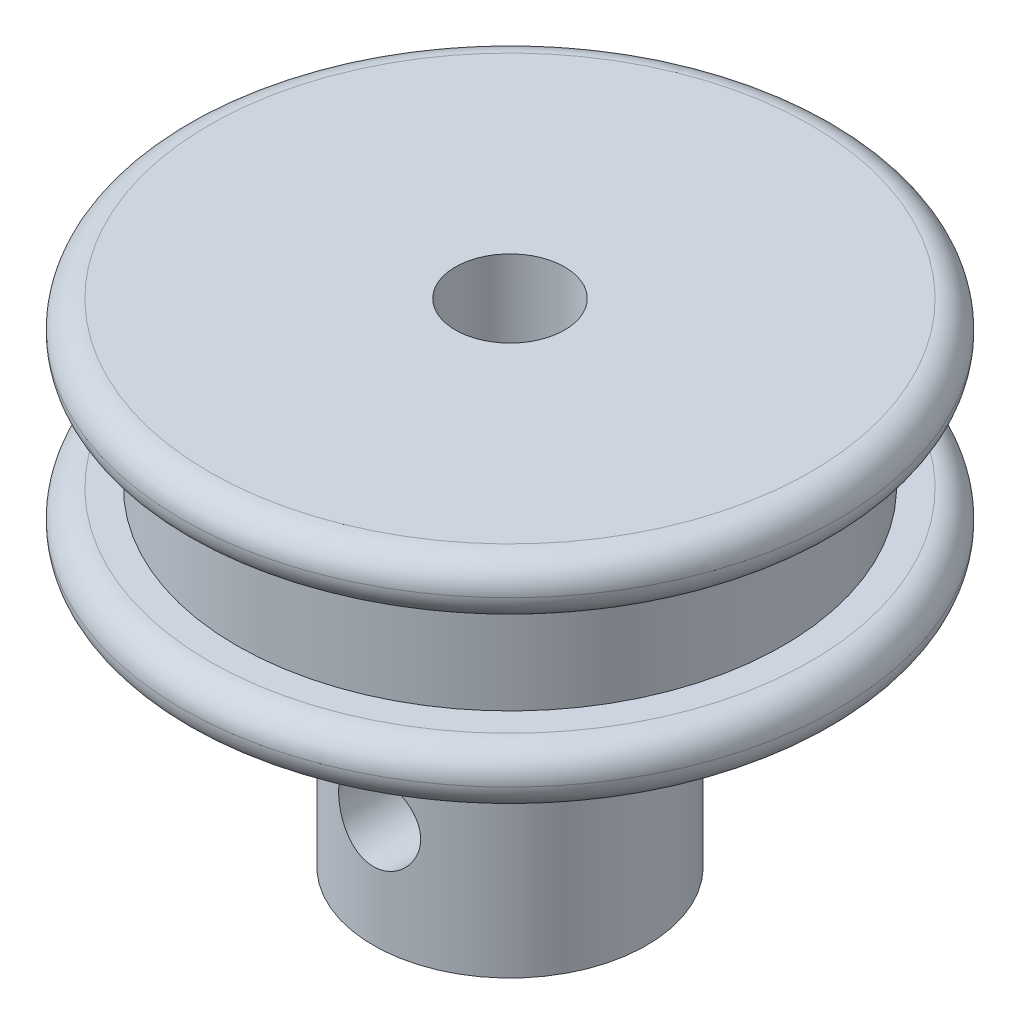
ISO-10303-21;
HEADER;
FILE_DESCRIPTION(('STEP AP214'),'2;1');
FILE_NAME('part.step','',(''),(''),'','','');
FILE_SCHEMA(('AUTOMOTIVE_DESIGN { 1 0 10303 214 1 1 1 1 }'));
ENDSEC;
DATA;
#1=APPLICATION_CONTEXT('core data for automotive mechanical design processes');
#2=APPLICATION_PROTOCOL_DEFINITION('international standard','automotive_design',2000,#1);
#3=PRODUCT_CONTEXT('',#1,'mechanical');
#4=PRODUCT('Part','Part','',(#3));
#5=PRODUCT_RELATED_PRODUCT_CATEGORY('part','',(#4));
#6=PRODUCT_DEFINITION_FORMATION('','',#4);
#7=PRODUCT_DEFINITION_CONTEXT('part definition',#1,'design');
#8=PRODUCT_DEFINITION('design','',#6,#7);
#9=PRODUCT_DEFINITION_SHAPE('','',#8);
#10=(LENGTH_UNIT() NAMED_UNIT(*) SI_UNIT(.MILLI.,.METRE.));
#11=(NAMED_UNIT(*) PLANE_ANGLE_UNIT() SI_UNIT($,.RADIAN.));
#12=(NAMED_UNIT(*) SI_UNIT($,.STERADIAN.) SOLID_ANGLE_UNIT());
#13=UNCERTAINTY_MEASURE_WITH_UNIT(LENGTH_MEASURE(1.E-05),#10,'distance_accuracy_value','');
#14=(GEOMETRIC_REPRESENTATION_CONTEXT(3) GLOBAL_UNCERTAINTY_ASSIGNED_CONTEXT((#13)) GLOBAL_UNIT_ASSIGNED_CONTEXT((#10,
#11,#12)) REPRESENTATION_CONTEXT('',''));
#15=CARTESIAN_POINT('',(0.,0.,0.));
#16=DIRECTION('',(0.,0.,1.));
#17=DIRECTION('',(1.,0.,0.));
#18=AXIS2_PLACEMENT_3D('',#15,#16,#17);
#19=CARTESIAN_POINT('',(0.,4.,0.));
#20=DIRECTION('',(0.,-1.,0.));
#21=DIRECTION('',(0.,0.,-1.));
#22=AXIS2_PLACEMENT_3D('',#19,#20,#21);
#23=CYLINDRICAL_SURFACE('',#22,10.);
#24=CARTESIAN_POINT('',(0.,4.,0.));
#25=DIRECTION('',(0.,1.,0.));
#26=DIRECTION('',(0.,0.,1.));
#27=AXIS2_PLACEMENT_3D('',#24,#25,#26);
#28=CIRCLE('',#27,10.);
#29=CARTESIAN_POINT('',(0.,4.,10.));
#30=VERTEX_POINT('',#29);
#31=EDGE_CURVE('E144',#30,#30,#28,.T.);
#32=ORIENTED_EDGE('',*,*,#31,.F.);
#33=EDGE_LOOP('',(#32));
#34=FACE_BOUND('',#33,.T.);
#35=CARTESIAN_POINT('',(0.,0.,0.));
#36=DIRECTION('',(0.,1.,0.));
#37=DIRECTION('',(0.,0.,1.));
#38=AXIS2_PLACEMENT_3D('',#35,#36,#37);
#39=CIRCLE('',#38,10.);
#40=CARTESIAN_POINT('',(0.,0.,10.));
#41=VERTEX_POINT('',#40);
#42=EDGE_CURVE('E141',#41,#41,#39,.T.);
#43=ORIENTED_EDGE('',*,*,#42,.T.);
#44=EDGE_LOOP('',(#43));
#45=FACE_BOUND('',#44,.T.);
#46=ADVANCED_FACE('F35',(#34,#45),#23,.T.);
#47=CARTESIAN_POINT('',(0.,6.,0.));
#48=DIRECTION('',(0.,1.,0.));
#49=DIRECTION('',(0.,0.,1.));
#50=AXIS2_PLACEMENT_3D('',#47,#48,#49);
#51=PLANE('',#50);
#52=CARTESIAN_POINT('',(0.,6.,0.));
#53=DIRECTION('',(0.,1.,0.));
#54=DIRECTION('',(0.,0.,1.));
#55=AXIS2_PLACEMENT_3D('',#52,#53,#54);
#56=CIRCLE('',#55,11.);
#57=CARTESIAN_POINT('',(0.,6.,11.));
#58=VERTEX_POINT('',#57);
#59=EDGE_CURVE('E48',#58,#58,#56,.T.);
#60=ORIENTED_EDGE('',*,*,#59,.T.);
#61=EDGE_LOOP('',(#60));
#62=FACE_BOUND('',#61,.T.);
#63=CARTESIAN_POINT('',(0.,6.,0.));
#64=DIRECTION('',(0.,-1.,0.));
#65=DIRECTION('',(0.,0.,-1.));
#66=AXIS2_PLACEMENT_3D('',#63,#64,#65);
#67=CIRCLE('',#66,2.);
#68=CARTESIAN_POINT('',(0.,6.,-2.));
#69=VERTEX_POINT('',#68);
#70=EDGE_CURVE('E152',#69,#69,#67,.T.);
#71=ORIENTED_EDGE('',*,*,#70,.T.);
#72=EDGE_LOOP('',(#71));
#73=FACE_BOUND('',#72,.T.);
#74=ADVANCED_FACE('F108',(#62,#73),#51,.T.);
#75=CARTESIAN_POINT('',(0.,4.,0.));
#76=DIRECTION('',(0.,1.,0.));
#77=DIRECTION('',(0.,0.,1.));
#78=AXIS2_PLACEMENT_3D('',#75,#76,#77);
#79=PLANE('',#78);
#80=CARTESIAN_POINT('',(0.,4.,0.));
#81=DIRECTION('',(0.,1.,0.));
#82=DIRECTION('',(0.,0.,1.));
#83=AXIS2_PLACEMENT_3D('',#80,#81,#82);
#84=CIRCLE('',#83,11.);
#85=CARTESIAN_POINT('',(0.,4.,11.));
#86=VERTEX_POINT('',#85);
#87=EDGE_CURVE('E53',#86,#86,#84,.F.);
#88=ORIENTED_EDGE('',*,*,#87,.T.);
#89=EDGE_LOOP('',(#88));
#90=FACE_BOUND('',#89,.T.);
#91=ORIENTED_EDGE('',*,*,#31,.T.);
#92=EDGE_LOOP('',(#91));
#93=FACE_BOUND('',#92,.T.);
#94=ADVANCED_FACE('F104',(#90,#93),#79,.F.);
#95=CARTESIAN_POINT('',(0.,-2.,0.));
#96=DIRECTION('',(0.,-1.,0.));
#97=DIRECTION('',(0.,0.,-1.));
#98=AXIS2_PLACEMENT_3D('',#95,#96,#97);
#99=PLANE('',#98);
#100=CARTESIAN_POINT('',(0.,-2.,0.));
#101=DIRECTION('',(0.,-1.,0.));
#102=DIRECTION('',(0.,0.,-1.));
#103=AXIS2_PLACEMENT_3D('',#100,#101,#102);
#104=CIRCLE('',#103,11.);
#105=CARTESIAN_POINT('',(0.,-2.,-11.));
#106=VERTEX_POINT('',#105);
#107=EDGE_CURVE('E10',#106,#106,#104,.T.);
#108=ORIENTED_EDGE('',*,*,#107,.T.);
#109=EDGE_LOOP('',(#108));
#110=FACE_BOUND('',#109,.T.);
#111=CARTESIAN_POINT('',(0.,-2.,0.));
#112=DIRECTION('',(0.,-1.,0.));
#113=DIRECTION('',(0.,0.,-1.));
#114=AXIS2_PLACEMENT_3D('',#111,#112,#113);
#115=CIRCLE('',#114,5.);
#116=CARTESIAN_POINT('',(0.,-2.,-5.));
#117=VERTEX_POINT('',#116);
#118=EDGE_CURVE('E138',#117,#117,#115,.T.);
#119=ORIENTED_EDGE('',*,*,#118,.F.);
#120=EDGE_LOOP('',(#119));
#121=FACE_BOUND('',#120,.T.);
#122=ADVANCED_FACE('F100',(#110,#121),#99,.T.);
#123=CARTESIAN_POINT('',(0.,0.,0.));
#124=DIRECTION('',(0.,-1.,0.));
#125=DIRECTION('',(0.,0.,-1.));
#126=AXIS2_PLACEMENT_3D('',#123,#124,#125);
#127=PLANE('',#126);
#128=CARTESIAN_POINT('',(0.,0.,0.));
#129=DIRECTION('',(0.,-1.,0.));
#130=DIRECTION('',(0.,0.,-1.));
#131=AXIS2_PLACEMENT_3D('',#128,#129,#130);
#132=CIRCLE('',#131,11.);
#133=CARTESIAN_POINT('',(0.,0.,-11.));
#134=VERTEX_POINT('',#133);
#135=EDGE_CURVE('E136',#134,#134,#132,.F.);
#136=ORIENTED_EDGE('',*,*,#135,.T.);
#137=EDGE_LOOP('',(#136));
#138=FACE_BOUND('',#137,.T.);
#139=ORIENTED_EDGE('',*,*,#42,.F.);
#140=EDGE_LOOP('',(#139));
#141=FACE_BOUND('',#140,.T.);
#142=ADVANCED_FACE('F98',(#138,#141),#127,.F.);
#143=CARTESIAN_POINT('',(0.,-12.,0.));
#144=DIRECTION('',(0.,1.,0.));
#145=DIRECTION('',(0.,0.,1.));
#146=AXIS2_PLACEMENT_3D('',#143,#144,#145);
#147=CYLINDRICAL_SURFACE('',#146,5.);
#148=CARTESIAN_POINT('',(0.,-9.5,5.));
#149=CARTESIAN_POINT('',(-0.0822886127533,-9.49999900251511,4.9999992925055));
#150=CARTESIAN_POINT('',(-0.164587318351529,-9.49320613637603,4.99794915693954));
#151=CARTESIAN_POINT('',(-0.326788125304881,-9.4662786457779,4.98997105593691));
#152=CARTESIAN_POINT('',(-0.40668950441142,-9.44614004197666,4.98404193389692));
#153=CARTESIAN_POINT('',(-0.561732707754526,-9.39325398308974,4.96895552501836));
#154=CARTESIAN_POINT('',(-0.636881364395372,-9.36052513038107,4.95980300250425));
#155=CARTESIAN_POINT('',(-0.780624181053131,-9.28346390694417,4.93922109237645));
#156=CARTESIAN_POINT('',(-0.849217467469669,-9.23912999260458,4.92779140192067));
#157=CARTESIAN_POINT('',(-0.979871797183745,-9.13877599252733,4.90350737192774));
#158=CARTESIAN_POINT('',(-1.04171807124434,-9.08248337411409,4.89062383657036));
#159=CARTESIAN_POINT('',(-1.15524920923324,-8.96039077008982,4.86505834210442));
#160=CARTESIAN_POINT('',(-1.20693236327441,-8.89458918787504,4.85237641724501));
#161=CARTESIAN_POINT('',(-1.29980037723708,-8.75352924696239,4.82834113993772));
#162=CARTESIAN_POINT('',(-1.34072309022213,-8.67809153900926,4.81702406663875));
#163=CARTESIAN_POINT('',(-1.4092139477476,-8.52101074576971,4.79743620394031));
#164=CARTESIAN_POINT('',(-1.43678529919973,-8.43936915607203,4.78916468313311));
#165=CARTESIAN_POINT('',(-1.47701633682652,-8.27460973386954,4.77690870838434));
#166=CARTESIAN_POINT('',(-1.49007196234677,-8.19159725613606,4.77281069324533));
#167=CARTESIAN_POINT('',(-1.50213730614672,-8.02446684378324,4.76902789749767));
#168=CARTESIAN_POINT('',(-1.50115042761078,-7.94034918194092,4.76934204760571));
#169=CARTESIAN_POINT('',(-1.48546977199812,-7.77661609139152,4.77424744067778));
#170=CARTESIAN_POINT('',(-1.47127205262685,-7.69694774963776,4.7786838859914));
#171=CARTESIAN_POINT('',(-1.43037420427056,-7.54118021372654,4.79108356228624));
#172=CARTESIAN_POINT('',(-1.40367284141641,-7.46508137262567,4.79904714132351));
#173=CARTESIAN_POINT('',(-1.33816026653682,-7.31739965033926,4.81772733074973));
#174=CARTESIAN_POINT('',(-1.29918816934643,-7.24589291604474,4.82848016115952));
#175=CARTESIAN_POINT('',(-1.21035222588683,-7.11026797798981,4.85150987000065));
#176=CARTESIAN_POINT('',(-1.16048574002588,-7.04615157058622,4.86378711746991));
#177=CARTESIAN_POINT('',(-1.04881290765546,-6.92431380923798,4.88911011297937));
#178=CARTESIAN_POINT('',(-0.986594907466973,-6.86697133597033,4.90216654310498));
#179=CARTESIAN_POINT('',(-0.853263259313968,-6.76344601593575,4.92712244063259));
#180=CARTESIAN_POINT('',(-0.782149051860889,-6.71726387158557,4.9390218351841));
#181=CARTESIAN_POINT('',(-0.632355038342804,-6.63714007753527,4.9604316006947));
#182=CARTESIAN_POINT('',(-0.553627749747951,-6.60328248375014,4.96992543668314));
#183=CARTESIAN_POINT('',(-0.39124541560352,-6.54940040990037,4.98533521832222));
#184=CARTESIAN_POINT('',(-0.307591751589583,-6.52937207146751,4.99125216186999));
#185=CARTESIAN_POINT('',(-0.140952242668333,-6.50434782210061,4.99868364643538));
#186=CARTESIAN_POINT('',(-0.058050097601188,-6.49883841419839,5.0003485041779));
#187=CARTESIAN_POINT('',(0.107499605823382,-6.50156915571208,4.9995292324176));
#188=CARTESIAN_POINT('',(0.19014719669078,-6.50980746965144,4.99704565677756));
#189=CARTESIAN_POINT('',(0.350903605309696,-6.53938461111149,4.98830696987163));
#190=CARTESIAN_POINT('',(0.429072772614169,-6.56042338758087,4.98213829799417));
#191=CARTESIAN_POINT('',(0.580754638954521,-6.6146432327782,4.96674347841533));
#192=CARTESIAN_POINT('',(0.654266777025583,-6.64782576103786,4.95751696321085));
#193=CARTESIAN_POINT('',(0.796437189461052,-6.72625316548113,4.93669654351325));
#194=CARTESIAN_POINT('',(0.864943826199669,-6.77175934094797,4.92505280829675));
#195=CARTESIAN_POINT('',(0.993523307980146,-6.87322475405281,4.90073468764318));
#196=CARTESIAN_POINT('',(1.05359403235593,-6.92918661188767,4.8880600443108));
#197=CARTESIAN_POINT('',(1.16585744551027,-7.05238730836934,4.86253171869138));
#198=CARTESIAN_POINT('',(1.21768481231503,-7.11996187577174,4.84968825033268));
#199=CARTESIAN_POINT('',(1.30928995072154,-7.26312793901353,4.82576515238464));
#200=CARTESIAN_POINT('',(1.34906803829472,-7.33871922455821,4.81468547654651));
#201=CARTESIAN_POINT('',(1.41517347127168,-7.49553249125469,4.79567189615055));
#202=CARTESIAN_POINT('',(1.4415634693705,-7.57672618653659,4.78772337843827));
#203=CARTESIAN_POINT('',(1.48021730815114,-7.74268796893148,4.77591594362794));
#204=CARTESIAN_POINT('',(1.49248598978779,-7.82745482078767,4.772055625083));
#205=CARTESIAN_POINT('',(1.50221984485059,-7.99436151837623,4.76899972496087));
#206=CARTESIAN_POINT('',(1.5002805530849,-8.07646365101758,4.76961647442754));
#207=CARTESIAN_POINT('',(1.48307505444813,-8.2391141033728,4.77499401288294));
#208=CARTESIAN_POINT('',(1.46780938124716,-8.31966248517635,4.77975463592551));
#209=CARTESIAN_POINT('',(1.42476888804136,-8.47594539914285,4.79275763670386));
#210=CARTESIAN_POINT('',(1.39715175507068,-8.55172728736169,4.80095604545965));
#211=CARTESIAN_POINT('',(1.33031507121129,-8.69764243881772,4.81990278909136));
#212=CARTESIAN_POINT('',(1.29109329962876,-8.76777461764076,4.83065161194312));
#213=CARTESIAN_POINT('',(1.20048763805072,-8.90316311652711,4.85397676425833));
#214=CARTESIAN_POINT('',(1.14871276092994,-8.96814876126041,4.86660540163798));
#215=CARTESIAN_POINT('',(1.03517434629782,-9.08870249830786,4.89201320450026));
#216=CARTESIAN_POINT('',(0.973408217134502,-9.14426813946776,4.90479240823905));
#217=CARTESIAN_POINT('',(0.839465762183249,-9.24602341229503,4.92950936570649));
#218=CARTESIAN_POINT('',(0.767037885790608,-9.29189144685549,4.94141159765674));
#219=CARTESIAN_POINT('',(0.61514137398353,-9.37073516990402,4.96260680455813));
#220=CARTESIAN_POINT('',(0.535676052998956,-9.40371688827451,4.97190099931067));
#221=CARTESIAN_POINT('',(0.380757712655282,-9.45289527565275,4.98602174969301));
#222=CARTESIAN_POINT('',(0.305786961954235,-9.47051167288325,4.99122027381068));
#223=CARTESIAN_POINT('',(0.15388019523078,-9.49406352524158,4.99820944494492));
#224=CARTESIAN_POINT('',(0.0769445098581397,-9.50000093270482,5.0000006615474));
#225=CARTESIAN_POINT('',(0.,-9.5,5.));
#226=B_SPLINE_CURVE_WITH_KNOTS('',3,(#148,#149,#150,#151,#152,#153,#154,#155,#156,#157,#158,
#159,#160,#161,#162,#163,#164,#165,#166,#167,#168,#169,#170,#171,#172,#173,#174,#175,#176,#177,
#178,#179,#180,#181,#182,#183,#184,#185,#186,#187,#188,#189,#190,#191,#192,#193,#194,#195,#196,
#197,#198,#199,#200,#201,#202,#203,#204,#205,#206,#207,#208,#209,#210,#211,#212,#213,#214,#215,
#216,#217,#218,#219,#220,#221,#222,#223,#224,#225),.UNSPECIFIED.,.T.,.F.,(4,2,2,2,2,2,2,2,2,2,2,
2,2,2,2,2,2,2,2,2,2,2,2,2,2,2,2,2,2,2,2,2,2,2,2,2,2,2,4),(0.,0.246583203612611,
0.493239964845999,0.739533676300873,0.985860164412701,1.23855602948191,1.49129437288633,
1.74971481004109,2.00807314543223,2.25919689356599,2.51025978319089,2.75226016697676,
2.99428443658001,3.23962426447119,3.48502360158555,3.74067104048166,3.99633456531071,
4.25371046881688,4.51101453528808,4.75908809438545,5.00712853550327,5.24956746682327,
5.49203554593728,5.74011305702908,5.98825282000191,6.24540400322819,6.5025484425268,
6.75847814951252,7.01432009460283,7.25950155466942,7.504673196616,7.74680040402721,
7.98897397553107,8.23996925679931,8.49102974897502,8.74942996156671,9.00770911595235,
9.23831691930459,9.46888616948874),.UNSPECIFIED.);
#227=CARTESIAN_POINT('',(0.,-9.5,5.));
#228=VERTEX_POINT('',#227);
#229=EDGE_CURVE('E63',#228,#228,#226,.T.);
#230=ORIENTED_EDGE('',*,*,#229,.T.);
#231=EDGE_LOOP('',(#230));
#232=FACE_BOUND('',#231,.T.);
#233=CARTESIAN_POINT('',(1.5,-8.,-4.76969600708473));
#234=CARTESIAN_POINT('',(1.49999897633764,-7.9178054520576,-4.7696968572698));
#235=CARTESIAN_POINT('',(1.49322108167142,-7.83560077585597,-4.77184390209069));
#236=CARTESIAN_POINT('',(1.46635844446749,-7.67359475040806,-4.780165783029));
#237=CARTESIAN_POINT('',(1.44626925573578,-7.59379421349853,-4.78634196493468));
#238=CARTESIAN_POINT('',(1.39352753269955,-7.43896527172827,-4.80196102485633));
#239=CARTESIAN_POINT('',(1.36089589394243,-7.36392917036691,-4.81139846703232));
#240=CARTESIAN_POINT('',(1.28406421917929,-7.2203780660047,-4.83246932547567));
#241=CARTESIAN_POINT('',(1.23986245137053,-7.15186404131556,-4.8441030704102));
#242=CARTESIAN_POINT('',(1.13964754141627,-7.02113360942262,-4.86866862185766));
#243=CARTESIAN_POINT('',(1.08333207175807,-6.95915410205371,-4.88162808311636));
#244=CARTESIAN_POINT('',(0.961136237579598,-6.84536204867749,-4.90714861936757));
#245=CARTESIAN_POINT('',(0.89525464546111,-6.79355080955012,-4.91970964297705));
#246=CARTESIAN_POINT('',(0.754111437793688,-6.70053730016669,-4.94333214579389));
#247=CARTESIAN_POINT('',(0.678684021335813,-6.65957657555719,-4.95435724342404));
#248=CARTESIAN_POINT('',(0.521624645369351,-6.59101274095724,-4.97334435920684));
#249=CARTESIAN_POINT('',(0.43999402838791,-6.56340675014255,-4.98130703789495));
#250=CARTESIAN_POINT('',(0.275323852630828,-6.52311999890949,-4.99307646003589));
#251=CARTESIAN_POINT('',(0.192391398953799,-6.5100348723473,-4.99699557369338));
#252=CARTESIAN_POINT('',(0.0254218237493131,-6.49788267535356,-5.00063201501348));
#253=CARTESIAN_POINT('',(-0.0586150620503701,-6.49881266059804,-5.00035022521079));
#254=CARTESIAN_POINT('',(-0.222571156600162,-6.51439286854302,-4.99569603817659));
#255=CARTESIAN_POINT('',(-0.302536267641343,-6.52860519380987,-4.9914542020526));
#256=CARTESIAN_POINT('',(-0.458889213442528,-6.56963133599429,-4.97951522112593));
#257=CARTESIAN_POINT('',(-0.535276821322847,-6.59644595094267,-4.97181785750586));
#258=CARTESIAN_POINT('',(-0.683347326351282,-6.66221202341856,-4.95365220986963));
#259=CARTESIAN_POINT('',(-0.754965064694479,-6.70130120280727,-4.94315269676706));
#260=CARTESIAN_POINT('',(-0.890764673783157,-6.79039785242823,-4.92049640648069));
#261=CARTESIAN_POINT('',(-0.954944774872132,-6.84040791296349,-4.90833923637778));
#262=CARTESIAN_POINT('',(-1.0766604815298,-6.9521977507516,-4.88311550488165));
#263=CARTESIAN_POINT('',(-1.13384458040112,-7.01435691902974,-4.87003195321461));
#264=CARTESIAN_POINT('',(-1.23707651539824,-7.14751001789005,-4.84483979887497));
#265=CARTESIAN_POINT('',(-1.28312324482853,-7.21850482538923,-4.8327312931702));
#266=CARTESIAN_POINT('',(-1.3631399533545,-7.36823946924899,-4.81077903197678));
#267=CARTESIAN_POINT('',(-1.39698989237679,-7.44704704586292,-4.80095810695957));
#268=CARTESIAN_POINT('',(-1.45083362878413,-7.60960720844554,-4.78496392548436));
#269=CARTESIAN_POINT('',(-1.4708319464056,-7.69335817153456,-4.7787894791583));
#270=CARTESIAN_POINT('',(-1.49574770282165,-7.86008236073928,-4.77104849541241));
#271=CARTESIAN_POINT('',(-1.50119946380212,-7.94296822389398,-4.7693187867044));
#272=CARTESIAN_POINT('',(-1.49835947233062,-8.10847290000987,-4.77021192441924));
#273=CARTESIAN_POINT('',(-1.4900696437133,-8.19109174873085,-4.77283416156589));
#274=CARTESIAN_POINT('',(-1.4604576357419,-8.35148837797087,-4.78197558554912));
#275=CARTESIAN_POINT('',(-1.4394796143128,-8.42933616426352,-4.78839176507489));
#276=CARTESIAN_POINT('',(-1.3854857774794,-8.58040169081492,-4.80429141231227));
#277=CARTESIAN_POINT('',(-1.35246810342759,-8.65361871414057,-4.81377535359073));
#278=CARTESIAN_POINT('',(-1.274318711965,-8.79551746407213,-4.83505835023047));
#279=CARTESIAN_POINT('',(-1.22888564172729,-8.86402472098579,-4.84691271069799));
#280=CARTESIAN_POINT('',(-1.12755301600385,-8.99263810618081,-4.87148205646987));
#281=CARTESIAN_POINT('',(-1.07165095534896,-9.05274221761279,-4.88419724730003));
#282=CARTESIAN_POINT('',(-0.948455132493598,-9.16518040581474,-4.90963633548158));
#283=CARTESIAN_POINT('',(-0.880811065857433,-9.21713562898698,-4.92234245063004));
#284=CARTESIAN_POINT('',(-0.737461784590248,-9.30896670102775,-4.94584851748651));
#285=CARTESIAN_POINT('',(-0.661756970543943,-9.34884314978146,-4.95664856384717));
#286=CARTESIAN_POINT('',(-0.50493550470522,-9.4150000305683,-4.97505970474957));
#287=CARTESIAN_POINT('',(-0.423864622037837,-9.44138201615898,-4.98269453424966));
#288=CARTESIAN_POINT('',(-0.258169966504586,-9.48006091889042,-4.99401979596827));
#289=CARTESIAN_POINT('',(-0.173547217354761,-9.49236186594842,-4.9977113567088));
#290=CARTESIAN_POINT('',(-0.00665215388274146,-9.5022230440545,-5.00066544081399));
#291=CARTESIAN_POINT('',(0.0755851790862079,-9.50033269540783,-5.00009305111322));
#292=CARTESIAN_POINT('',(0.238519481164405,-9.48317836750088,-4.99497264465037));
#293=CARTESIAN_POINT('',(0.31921653734653,-9.46791514651956,-4.99042485330462));
#294=CARTESIAN_POINT('',(0.47593581304136,-9.42478833860038,-4.97791168358327));
#295=CARTESIAN_POINT('',(0.551998927351393,-9.39706181935099,-4.96998352900866));
#296=CARTESIAN_POINT('',(0.698433237752054,-9.32991808549281,-4.9515294303945));
#297=CARTESIAN_POINT('',(0.768803496050581,-9.29049894971381,-4.94100305949946));
#298=CARTESIAN_POINT('',(0.904301892420565,-9.19962654256996,-4.91803965828228));
#299=CARTESIAN_POINT('',(0.969190250076768,-9.14782856999923,-4.90555226923559));
#300=CARTESIAN_POINT('',(1.08953757134595,-9.0342896116672,-4.88023537212334));
#301=CARTESIAN_POINT('',(1.14499380960194,-8.97254576210185,-4.86740576641079));
#302=CARTESIAN_POINT('',(1.24656269394549,-8.83865922168949,-4.84240680631319));
#303=CARTESIAN_POINT('',(1.29234759757956,-8.76626144660956,-4.83026852693485));
#304=CARTESIAN_POINT('',(1.37104313528776,-8.61444482583898,-4.80852547508793));
#305=CARTESIAN_POINT('',(1.40395995557289,-8.53502937639881,-4.79891948596956));
#306=CARTESIAN_POINT('',(1.4530194253295,-8.38025956839373,-4.78427816717595));
#307=CARTESIAN_POINT('',(1.47058859011232,-8.30539135306901,-4.7788615484052));
#308=CARTESIAN_POINT('',(1.49407818835144,-8.15368477750423,-4.77157042597167));
#309=CARTESIAN_POINT('',(1.50000095706095,-8.07684681535475,-4.7696952122143));
#310=CARTESIAN_POINT('',(1.5,-8.,-4.76969600708473));
#311=B_SPLINE_CURVE_WITH_KNOTS('',3,(#233,#234,#235,#236,#237,#238,#239,#240,#241,#242,#243,
#244,#245,#246,#247,#248,#249,#250,#251,#252,#253,#254,#255,#256,#257,#258,#259,#260,#261,#262,
#263,#264,#265,#266,#267,#268,#269,#270,#271,#272,#273,#274,#275,#276,#277,#278,#279,#280,#281,
#282,#283,#284,#285,#286,#287,#288,#289,#290,#291,#292,#293,#294,#295,#296,#297,#298,#299,#300,
#301,#302,#303,#304,#305,#306,#307,#308,#309,#310),.UNSPECIFIED.,.T.,.F.,(4,2,2,2,2,2,2,2,2,2,2,
2,2,2,2,2,2,2,2,2,2,2,2,2,2,2,2,2,2,2,2,2,2,2,2,2,2,2,4),(0.,0.246300165915543,
0.492682641689001,0.738656414466195,0.984667025370102,1.23773150007984,1.49082847871273,
1.74915939273645,2.00743455587877,2.25832140149558,2.50915554101441,2.7520012599088,
2.99486235890376,3.24055209335676,3.48630016590831,3.74152147023278,3.99676812491863,
4.25446238246266,4.51207250628411,4.76008080790309,5.00805439107388,5.24958594938817,
5.49115481045788,5.73920731809389,5.98731925928923,6.24479506100602,6.50225807324202,
6.75775391814325,7.01317662321682,7.2587630391122,7.50433553047755,7.74727096872219,
7.99024634491378,8.24099627054489,8.4918185262989,8.75011639669147,9.00828993963944,
9.23861153857448,9.4688869503356),.UNSPECIFIED.);
#312=CARTESIAN_POINT('',(1.5,-8.,-4.76969600708473));
#313=VERTEX_POINT('',#312);
#314=EDGE_CURVE('E83',#313,#313,#311,.T.);
#315=ORIENTED_EDGE('',*,*,#314,.T.);
#316=EDGE_LOOP('',(#315));
#317=FACE_BOUND('',#316,.T.);
#318=CARTESIAN_POINT('',(0.,-12.,0.));
#319=DIRECTION('',(0.,-1.,0.));
#320=DIRECTION('',(0.,0.,-1.));
#321=AXIS2_PLACEMENT_3D('',#318,#319,#320);
#322=CIRCLE('',#321,5.);
#323=CARTESIAN_POINT('',(0.,-12.,-5.));
#324=VERTEX_POINT('',#323);
#325=EDGE_CURVE('E145',#324,#324,#322,.T.);
#326=ORIENTED_EDGE('',*,*,#325,.F.);
#327=EDGE_LOOP('',(#326));
#328=FACE_BOUND('',#327,.T.);
#329=ORIENTED_EDGE('',*,*,#118,.T.);
#330=EDGE_LOOP('',(#329));
#331=FACE_BOUND('',#330,.T.);
#332=ADVANCED_FACE('F93',(#232,#317,#328,#331),#147,.T.);
#333=CARTESIAN_POINT('',(0.,-12.,0.));
#334=DIRECTION('',(0.,-1.,0.));
#335=DIRECTION('',(0.,0.,-1.));
#336=AXIS2_PLACEMENT_3D('',#333,#334,#335);
#337=PLANE('',#336);
#338=CARTESIAN_POINT('',(0.,-12.,0.));
#339=DIRECTION('',(0.,-1.,0.));
#340=DIRECTION('',(0.,0.,-1.));
#341=AXIS2_PLACEMENT_3D('',#338,#339,#340);
#342=CIRCLE('',#341,2.);
#343=CARTESIAN_POINT('',(0.,-12.,-2.));
#344=VERTEX_POINT('',#343);
#345=EDGE_CURVE('E60',#344,#344,#342,.T.);
#346=ORIENTED_EDGE('',*,*,#345,.F.);
#347=EDGE_LOOP('',(#346));
#348=FACE_BOUND('',#347,.T.);
#349=ORIENTED_EDGE('',*,*,#325,.T.);
#350=EDGE_LOOP('',(#349));
#351=FACE_BOUND('',#350,.T.);
#352=ADVANCED_FACE('F97',(#348,#351),#337,.T.);
#353=CARTESIAN_POINT('',(0.,6.,0.));
#354=DIRECTION('',(0.,-1.,0.));
#355=DIRECTION('',(0.,0.,-1.));
#356=AXIS2_PLACEMENT_3D('',#353,#354,#355);
#357=CYLINDRICAL_SURFACE('',#356,2.);
#358=CARTESIAN_POINT('',(0.,-6.5,-2.));
#359=CARTESIAN_POINT('',(0.0732207358411543,-6.50000479201202,-1.99999540196395));
#360=CARTESIAN_POINT('',(0.146561062021485,-6.5054050243745,-1.99593645526274));
#361=CARTESIAN_POINT('',(0.290936396286467,-6.52666706341016,-1.98006607281083));
#362=CARTESIAN_POINT('',(0.361965136229004,-6.54255517165005,-1.96823514679854));
#363=CARTESIAN_POINT('',(0.499234626631249,-6.58371290928377,-1.9379567495606));
#364=CARTESIAN_POINT('',(0.565501615403737,-6.60892551356917,-1.91954951932009));
#365=CARTESIAN_POINT('',(0.692422335520753,-6.66754234418723,-1.87750556721694));
#366=CARTESIAN_POINT('',(0.753077701796333,-6.70094417419352,-1.85387037535483));
#367=CARTESIAN_POINT('',(0.873465937590145,-6.77826301159082,-1.80049544543983));
#368=CARTESIAN_POINT('',(0.932593229272033,-6.82286732933407,-1.77039308548439));
#369=CARTESIAN_POINT('',(1.04302716767671,-6.91949583736117,-1.70767017883378));
#370=CARTESIAN_POINT('',(1.09432148272226,-6.97153148279983,-1.67504578078609));
#371=CARTESIAN_POINT('',(1.19837161436623,-7.09358295327837,-1.6027112365199));
#372=CARTESIAN_POINT('',(1.24930578421204,-7.1651036771217,-1.56290854864639));
#373=CARTESIAN_POINT('',(1.33861998176348,-7.31745101236655,-1.48711444664135));
#374=CARTESIAN_POINT('',(1.37701716983077,-7.39826469700031,-1.45111786883675));
#375=CARTESIAN_POINT('',(1.42880627811788,-7.53950283867623,-1.39977155180179));
#376=CARTESIAN_POINT('',(1.44625674456539,-7.59739069712838,-1.38157751186733));
#377=CARTESIAN_POINT('',(1.47420672564844,-7.71639273478492,-1.35171594150685));
#378=CARTESIAN_POINT('',(1.48472215355267,-7.77749917787479,-1.34003347910832));
#379=CARTESIAN_POINT('',(1.49812822141445,-7.90218258553077,-1.32503759684553));
#380=CARTESIAN_POINT('',(1.50094954854207,-7.96577680672405,-1.32180026676597));
#381=CARTESIAN_POINT('',(1.49848213241869,-8.09261491088157,-1.32459531776068));
#382=CARTESIAN_POINT('',(1.49319048157349,-8.15585866008744,-1.33063102218113));
#383=CARTESIAN_POINT('',(1.47597739291882,-8.27319134742579,-1.34967623262519));
#384=CARTESIAN_POINT('',(1.46482486380817,-8.32753637104618,-1.36187157059871));
#385=CARTESIAN_POINT('',(1.43705671120733,-8.43343887872087,-1.39114192844939));
#386=CARTESIAN_POINT('',(1.42043583681172,-8.48499362782359,-1.40822163640769));
#387=CARTESIAN_POINT('',(1.37033064172535,-8.61625638663415,-1.45741769294306));
#388=CARTESIAN_POINT('',(1.3328014849398,-8.69340041664351,-1.49225649139232));
#389=CARTESIAN_POINT('',(1.24618023314519,-8.83919652386908,-1.56533298145196));
#390=CARTESIAN_POINT('',(1.19706004255879,-8.90782733925466,-1.60357878886109));
#391=CARTESIAN_POINT('',(1.08651604102136,-9.03775339040365,-1.68051672313145));
#392=CARTESIAN_POINT('',(1.02481375526037,-9.09882060688148,-1.71919586730239));
#393=CARTESIAN_POINT('',(0.890422521709592,-9.21026364678116,-1.79248037980972));
#394=CARTESIAN_POINT('',(0.81775505429376,-9.26065992023038,-1.8270934826376));
#395=CARTESIAN_POINT('',(0.677902080454147,-9.33998079924033,-1.88279726073643));
#396=CARTESIAN_POINT('',(0.612539870185625,-9.37118459421578,-1.90520770945008));
#397=CARTESIAN_POINT('',(0.476352173202091,-9.42422488046386,-1.94372904416947));
#398=CARTESIAN_POINT('',(0.405530141063771,-9.44606723849928,-1.95984387504351));
#399=CARTESIAN_POINT('',(0.259676232483523,-9.47925336288644,-1.98445588635989));
#400=CARTESIAN_POINT('',(0.184621281405947,-9.49053217893863,-1.99290592971749));
#401=CARTESIAN_POINT('',(0.0332012397969218,-9.50154959737171,-2.00115883659445));
#402=CARTESIAN_POINT('',(-0.0431632843727189,-9.50129306869537,-2.00096534845408));
#403=CARTESIAN_POINT('',(-0.186804217329621,-9.48988913072681,-1.99242547175873));
#404=CARTESIAN_POINT('',(-0.254222327546129,-9.47983946311133,-1.98490086600401));
#405=CARTESIAN_POINT('',(-0.386110670609114,-9.45102621999214,-1.96351320201588));
#406=CARTESIAN_POINT('',(-0.450580272987257,-9.43226079031059,-1.94964879507262));
#407=CARTESIAN_POINT('',(-0.577416779689766,-9.3861124694069,-1.91599830683313));
#408=CARTESIAN_POINT('',(-0.639629172536135,-9.35844881857261,-1.89602050290194));
#409=CARTESIAN_POINT('',(-0.758518527043069,-9.29582754457441,-1.85166985411963));
#410=CARTESIAN_POINT('',(-0.815194721336399,-9.26086891236027,-1.82729640132068));
#411=CARTESIAN_POINT('',(-0.931511626319033,-9.17821675358944,-1.77119146886499));
#412=CARTESIAN_POINT('',(-0.990066762698699,-9.12937146056255,-1.73891095025037));
#413=CARTESIAN_POINT('',(-1.09871974855854,-9.02399124741161,-1.67238952874785));
#414=CARTESIAN_POINT('',(-1.14879830469577,-8.96743930030664,-1.63814438507395));
#415=CARTESIAN_POINT('',(-1.24877541075626,-8.83585011903883,-1.56369128291497));
#416=CARTESIAN_POINT('',(-1.29683043648705,-8.7593424385077,-1.52358718520101));
#417=CARTESIAN_POINT('',(-1.37923235998282,-8.59663992202755,-1.44940591348451));
#418=CARTESIAN_POINT('',(-1.41362000515519,-8.51047487809143,-1.41531099570969));
#419=CARTESIAN_POINT('',(-1.45615734256767,-8.36458555112553,-1.37118877808583));
#420=CARTESIAN_POINT('',(-1.46931009512996,-8.30760887359762,-1.35695811824565));
#421=CARTESIAN_POINT('',(-1.48891522181906,-8.19129295301682,-1.33542056103011));
#422=CARTESIAN_POINT('',(-1.4953825519924,-8.13195929319775,-1.32809821220233));
#423=CARTESIAN_POINT('',(-1.50115320209064,-8.01217092018868,-1.32157601792209));
#424=CARTESIAN_POINT('',(-1.50042015325262,-7.95171205699043,-1.32241740684975));
#425=CARTESIAN_POINT('',(-1.49176883838219,-7.83194316124785,-1.33216448543666));
#426=CARTESIAN_POINT('',(-1.48384130024585,-7.77263471210275,-1.34108058157484));
#427=CARTESIAN_POINT('',(-1.45893841819723,-7.6440854285892,-1.36817348797772));
#428=CARTESIAN_POINT('',(-1.44036567954111,-7.57550281986723,-1.38794705950643));
#429=CARTESIAN_POINT('',(-1.39469627266119,-7.44346515116952,-1.4338296338541));
#430=CARTESIAN_POINT('',(-1.3675780729773,-7.38002355796181,-1.4599546014693));
#431=CARTESIAN_POINT('',(-1.29498918933643,-7.23747936951367,-1.52516477328824));
#432=CARTESIAN_POINT('',(-1.2464154206597,-7.16057841724425,-1.56560203191105));
#433=CARTESIAN_POINT('',(-1.13650718465936,-7.01687395502244,-1.64713510181273));
#434=CARTESIAN_POINT('',(-1.07516134758577,-6.95007953405516,-1.68823146954222));
#435=CARTESIAN_POINT('',(-0.939627144937894,-6.82716815771667,-1.76728988939793));
#436=CARTESIAN_POINT('',(-0.865337161562863,-6.77114368062281,-1.80522333711072));
#437=CARTESIAN_POINT('',(-0.705159098936207,-6.67277694885465,-1.87357289668097));
#438=CARTESIAN_POINT('',(-0.619299420401798,-6.6304020254275,-1.90400691592959));
#439=CARTESIAN_POINT('',(-0.464840290356459,-6.57220057901429,-1.94636704624048));
#440=CARTESIAN_POINT('',(-0.398553614774737,-6.55223326862383,-1.96110322499718));
#441=CARTESIAN_POINT('',(-0.262841610392765,-6.52158209738851,-1.98383739970238));
#442=CARTESIAN_POINT('',(-0.19342562383491,-6.51087230975004,-1.99185421210894));
#443=CARTESIAN_POINT('',(-0.102963309861893,-6.50339530578565,-1.99745471706309));
#444=CARTESIAN_POINT('',(-0.082406945994127,-6.50212372251058,-1.9984076143208));
#445=CARTESIAN_POINT('',(-0.0412368896243799,-6.50042532676903,-1.99968095423138));
#446=CARTESIAN_POINT('',(-0.0206231884283889,-6.49999865029263,-2.00000129507253));
#447=CARTESIAN_POINT('',(0.,-6.5,-2.));
#448=B_SPLINE_CURVE_WITH_KNOTS('',3,(#358,#359,#360,#361,#362,#363,#364,#365,#366,#367,#368,
#369,#370,#371,#372,#373,#374,#375,#376,#377,#378,#379,#380,#381,#382,#383,#384,#385,#386,#387,
#388,#389,#390,#391,#392,#393,#394,#395,#396,#397,#398,#399,#400,#401,#402,#403,#404,#405,#406,
#407,#408,#409,#410,#411,#412,#413,#414,#415,#416,#417,#418,#419,#420,#421,#422,#423,#424,#425,
#426,#427,#428,#429,#430,#431,#432,#433,#434,#435,#436,#437,#438,#439,#440,#441,#442,#443,#444,
#445,#446,#447),.UNSPECIFIED.,.T.,.F.,(4,2,2,2,2,2,2,2,2,2,2,2,2,2,2,2,2,2,2,2,2,2,2,2,2,2,2,2,
2,2,2,2,2,2,2,2,2,2,2,2,2,2,2,2,4),(0.,0.219571786572042,0.439696319423244,0.658496333573382,
0.877232398849293,1.1162243131743,1.35558868405162,1.64360015887451,1.93121574056507,
2.11999518529901,2.3083399319529,2.49837587621257,2.6884799430021,2.85826890162709,
3.02822137600639,3.3044933180591,3.58144192357889,3.8653588393809,4.1487266249369,
4.37526505006389,4.60166129643117,4.82944058166898,5.05712372466613,5.26191187011994,
5.46674360185812,5.6788043948368,5.89089453977541,6.13840382081868,6.38646908985451,
6.68168596015946,6.97601595850112,7.15589161422933,7.33536399114208,7.51574333854741,
7.69635548563854,7.91639670960134,8.13699685139921,8.43412246655768,8.73151372390893,
9.0313544949265,9.33047220273164,9.5419569754163,9.75284752283256,9.81468166878711,
9.87652576630966),.UNSPECIFIED.);
#449=CARTESIAN_POINT('',(0.,-6.5,-2.));
#450=VERTEX_POINT('',#449);
#451=EDGE_CURVE('E39',#450,#450,#448,.T.);
#452=ORIENTED_EDGE('',*,*,#451,.T.);
#453=EDGE_LOOP('',(#452));
#454=FACE_BOUND('',#453,.T.);
#455=CARTESIAN_POINT('',(1.5,-8.,1.32287565553229));
#456=CARTESIAN_POINT('',(1.49999219049447,-7.93000257657437,1.32289190044095));
#457=CARTESIAN_POINT('',(1.4950410907442,-7.85995416568808,1.32856366615417));
#458=CARTESIAN_POINT('',(1.47578333210409,-7.72267014379052,1.34990644032801));
#459=CARTESIAN_POINT('',(1.46144878565587,-7.65544355498049,1.3656072516867));
#460=CARTESIAN_POINT('',(1.42483838991846,-7.52642015326162,1.4037512791687));
#461=CARTESIAN_POINT('',(1.40267483444956,-7.46456122323754,1.42609848244814));
#462=CARTESIAN_POINT('',(1.35130655299363,-7.34565454555481,1.47486455031267));
#463=CARTESIAN_POINT('',(1.3221026780169,-7.28860621753078,1.50128292264932));
#464=CARTESIAN_POINT('',(1.25039909811054,-7.16788720368341,1.56177312961147));
#465=CARTESIAN_POINT('',(1.20639573950363,-7.10533206577352,1.59628904009787));
#466=CARTESIAN_POINT('',(1.10933596759308,-6.98747453375773,1.66521164096378));
#467=CARTESIAN_POINT('',(1.05626622282799,-6.93218303517973,1.69961809339876));
#468=CARTESIAN_POINT('',(0.929610192252514,-6.81914126134453,1.77262582436251));
#469=CARTESIAN_POINT('',(0.854047289142163,-6.76319403328014,1.81064921229759));
#470=CARTESIAN_POINT('',(0.69118971482194,-6.66537779171716,1.87882809751632));
#471=CARTESIAN_POINT('',(0.603923293836167,-6.62347570253119,1.90900204180106));
#472=CARTESIAN_POINT('',(0.447869023983645,-6.56679231409706,1.95034258990248));
#473=CARTESIAN_POINT('',(0.381446049692536,-6.54764290402153,1.96449710921006));
#474=CARTESIAN_POINT('',(0.245552609316542,-6.51860988400325,1.98605635937555));
#475=CARTESIAN_POINT('',(0.176084845995169,-6.50871822389326,1.99346695432364));
#476=CARTESIAN_POINT('',(0.0358650926220275,-6.49877826613751,2.00091375578087));
#477=CARTESIAN_POINT('',(-0.0348897591186393,-6.49875554562356,2.00093080057496));
#478=CARTESIAN_POINT('',(-0.175316156674037,-6.50861793678029,1.99354206503066));
#479=CARTESIAN_POINT('',(-0.244987447822227,-6.51850534290814,1.98613456571337));
#480=CARTESIAN_POINT('',(-0.378889193792652,-6.54708105058987,1.96491377944411));
#481=CARTESIAN_POINT('',(-0.443224268236296,-6.56545632638707,1.9513285776568));
#482=CARTESIAN_POINT('',(-0.567680485046397,-6.60999564218224,1.91882278657017));
#483=CARTESIAN_POINT('',(-0.627800705033636,-6.63616138051316,1.89990103394193));
#484=CARTESIAN_POINT('',(-0.74921692186473,-6.69852961514531,1.85561045984504));
#485=CARTESIAN_POINT('',(-0.809935384713598,-6.73551209661876,1.82976540608097));
#486=CARTESIAN_POINT('',(-0.924567250548284,-6.81673370397051,1.77460702483739));
#487=CARTESIAN_POINT('',(-0.978474784621221,-6.8609790136999,1.74529074780453));
#488=CARTESIAN_POINT('',(-1.08908204283329,-6.96522334882094,1.6789376587236));
#489=CARTESIAN_POINT('',(-1.14424493004784,-7.0266092100264,1.64151655866368));
#490=CARTESIAN_POINT('',(-1.24400875556228,-7.15783458362194,1.56725958283769));
#491=CARTESIAN_POINT('',(-1.28860466211477,-7.22767809952506,1.53042399363524));
#492=CARTESIAN_POINT('',(-1.35873206411601,-7.36098187024563,1.46819425999159));
#493=CARTESIAN_POINT('',(-1.38628866868103,-7.42298704530065,1.44197599789983));
#494=CARTESIAN_POINT('',(-1.43319397108784,-7.55206528141938,1.39536741257394));
#495=CARTESIAN_POINT('',(-1.45256121808259,-7.61912647969037,1.37496395320511));
#496=CARTESIAN_POINT('',(-1.47902385350669,-7.74368694399832,1.34640050620232));
#497=CARTESIAN_POINT('',(-1.48779069496582,-7.80044708211686,1.3366153955687));
#498=CARTESIAN_POINT('',(-1.49871760619789,-7.91535546617383,1.32435588438334));
#499=CARTESIAN_POINT('',(-1.50088612873265,-7.97350183990282,1.32187213058307));
#500=CARTESIAN_POINT('',(-1.49845270115552,-8.08947899173339,1.32462868790497));
#501=CARTESIAN_POINT('',(-1.4938482589949,-8.14730964580967,1.32987184207164));
#502=CARTESIAN_POINT('',(-1.47822527271969,-8.26107615244287,1.34721218775046));
#503=CARTESIAN_POINT('',(-1.46719578056394,-8.3170085979481,1.35932107727345));
#504=CARTESIAN_POINT('',(-1.43413959562387,-8.44633804493887,1.39427758287802));
#505=CARTESIAN_POINT('',(-1.40954189769242,-8.51843595391503,1.41944823697315));
#506=CARTESIAN_POINT('',(-1.35088877838435,-8.65630766364011,1.47537861079975));
#507=CARTESIAN_POINT('',(-1.31681594335477,-8.72206951729474,1.5061485847723));
#508=CARTESIAN_POINT('',(-1.23869774116696,-8.84934900804812,1.57108282375649));
#509=CARTESIAN_POINT('',(-1.19434110060342,-8.91063287621825,1.60532883846045));
#510=CARTESIAN_POINT('',(-1.09682562914593,-9.02600209636124,1.67347506272361));
#511=CARTESIAN_POINT('',(-1.04366252194464,-9.08008392798893,1.70737509574665));
#512=CARTESIAN_POINT('',(-0.916234513829628,-9.19127699162936,1.77960222623532));
#513=CARTESIAN_POINT('',(-0.839896270946864,-9.24647523885759,1.81728174165356));
#514=CARTESIAN_POINT('',(-0.675551612651275,-9.34262073345087,1.88453104769825));
#515=CARTESIAN_POINT('',(-0.587571029974858,-9.38359882458129,1.91411836052283));
#516=CARTESIAN_POINT('',(-0.430755661496917,-9.43843799144686,1.95419406402379));
#517=CARTESIAN_POINT('',(-0.364250057327479,-9.45675679327544,1.96775478029639));
#518=CARTESIAN_POINT('',(-0.228364464964359,-9.48412879630752,1.98810265589123));
#519=CARTESIAN_POINT('',(-0.158987104561949,-9.49319028154851,1.9948958710696));
#520=CARTESIAN_POINT('',(-0.0191476059404054,-9.50151639092861,2.00113566717062));
#521=CARTESIAN_POINT('',(0.051316692587081,-9.50075801734825,2.00056500218907));
#522=CARTESIAN_POINT('',(0.191009011030075,-9.48943900869876,1.9920880324381));
#523=CARTESIAN_POINT('',(0.260236696591283,-9.47887576229252,1.98417977344351));
#524=CARTESIAN_POINT('',(0.393521935254966,-9.44902508383276,1.96203400925195));
#525=CARTESIAN_POINT('',(0.457671236511436,-9.42999981867845,1.94798690792879));
#526=CARTESIAN_POINT('',(0.581661343097384,-9.38421193438106,1.91462720575136));
#527=CARTESIAN_POINT('',(0.64150122338881,-9.35744766016909,1.89531347862387));
#528=CARTESIAN_POINT('',(0.762547698766807,-9.29372206240404,1.85017642210641));
#529=CARTESIAN_POINT('',(0.823141236713413,-9.25594906864042,1.82386352707581));
#530=CARTESIAN_POINT('',(0.937414811724209,-9.17313355944579,1.76785506075717));
#531=CARTESIAN_POINT('',(0.991088412383368,-9.12808436271396,1.73815638795658));
#532=CARTESIAN_POINT('',(1.10112380660681,-9.02199463343921,1.67106353042107));
#533=CARTESIAN_POINT('',(1.15591691541995,-8.9595536005601,1.63330922504697));
#534=CARTESIAN_POINT('',(1.2547525342935,-8.82613192810013,1.55866082463333));
#535=CARTESIAN_POINT('',(1.29879110556728,-8.75514817396344,1.52176704921892));
#536=CARTESIAN_POINT('',(1.36695971301454,-8.6211167494097,1.46049601449285));
#537=CARTESIAN_POINT('',(1.39333526337998,-8.55966501729345,1.43513625007637));
#538=CARTESIAN_POINT('',(1.43805398028599,-8.43191708694413,1.39032564651233));
#539=CARTESIAN_POINT('',(1.45641847678344,-8.36563430840455,1.37085915899696));
#540=CARTESIAN_POINT('',(1.4799705775638,-8.24921178040307,1.34532423383262));
#541=CARTESIAN_POINT('',(1.48744249026866,-8.20003292870954,1.3370013026568));
#542=CARTESIAN_POINT('',(1.49745839072448,-8.10057766696635,1.32577295392455));
#543=CARTESIAN_POINT('',(1.50000561211714,-8.05030199905628,1.32286398151145));
#544=CARTESIAN_POINT('',(1.5,-8.,1.32287565553229));
#545=B_SPLINE_CURVE_WITH_KNOTS('',3,(#455,#456,#457,#458,#459,#460,#461,#462,#463,#464,#465,
#466,#467,#468,#469,#470,#471,#472,#473,#474,#475,#476,#477,#478,#479,#480,#481,#482,#483,#484,
#485,#486,#487,#488,#489,#490,#491,#492,#493,#494,#495,#496,#497,#498,#499,#500,#501,#502,#503,
#504,#505,#506,#507,#508,#509,#510,#511,#512,#513,#514,#515,#516,#517,#518,#519,#520,#521,#522,
#523,#524,#525,#526,#527,#528,#529,#530,#531,#532,#533,#534,#535,#536,#537,#538,#539,#540,#541,
#542,#543,#544),.UNSPECIFIED.,.T.,.F.,(4,2,2,2,2,2,2,2,2,2,2,2,2,2,2,2,2,2,2,2,2,2,2,2,2,2,2,2,
2,2,2,2,2,2,2,2,2,2,2,2,2,2,2,2,4),(0.,0.20973177668449,0.420089722582994,0.627545385620139,
0.834975984672344,1.08585208691169,1.33710031031849,1.63964848103538,1.94147907444963,
2.15227725277555,2.36289195870711,2.57405250727807,2.78526195641288,2.9892375589505,
3.19325766108669,3.41936844116895,3.64567274887663,3.91649517204702,4.18744629647933,
4.40499409477197,4.62204646613006,4.79608005545901,4.96989060538193,5.14376512326213,
5.31793678696019,5.55730028202397,5.7971066263915,6.04543209090059,6.29387849446617,
6.59652499511462,6.89851088586564,7.10852896194426,7.3183589353918,7.52868041101043,
7.73905791773944,7.94332812691912,8.14764205379332,8.37510052489609,8.60276905744644,
8.87547580578154,9.1482822820853,9.36218279640835,9.57551025772699,9.72632812073766,
9.87704692032409),.UNSPECIFIED.);
#546=CARTESIAN_POINT('',(1.5,-8.,1.32287565553229));
#547=VERTEX_POINT('',#546);
#548=EDGE_CURVE('E64',#547,#547,#545,.T.);
#549=ORIENTED_EDGE('',*,*,#548,.T.);
#550=EDGE_LOOP('',(#549));
#551=FACE_BOUND('',#550,.T.);
#552=ORIENTED_EDGE('',*,*,#70,.F.);
#553=EDGE_LOOP('',(#552));
#554=FACE_BOUND('',#553,.T.);
#555=ORIENTED_EDGE('',*,*,#345,.T.);
#556=EDGE_LOOP('',(#555));
#557=FACE_BOUND('',#556,.T.);
#558=ADVANCED_FACE('F69',(#454,#551,#554,#557),#357,.F.);
#559=CARTESIAN_POINT('',(0.,-1.,0.));
#560=DIRECTION('',(0.,-1.,0.));
#561=DIRECTION('',(0.,0.,-1.));
#562=AXIS2_PLACEMENT_3D('',#559,#560,#561);
#563=TOROIDAL_SURFACE('',#562,11.,1.);
#564=ORIENTED_EDGE('',*,*,#107,.F.);
#565=EDGE_LOOP('',(#564));
#566=FACE_BOUND('',#565,.T.);
#567=CARTESIAN_POINT('',(0.,-1.,0.));
#568=DIRECTION('',(0.,-1.,0.));
#569=DIRECTION('',(0.,0.,-1.));
#570=AXIS2_PLACEMENT_3D('',#567,#568,#569);
#571=CIRCLE('',#570,12.);
#572=CARTESIAN_POINT('',(0.,-1.,-12.));
#573=VERTEX_POINT('',#572);
#574=EDGE_CURVE('E57',#573,#573,#571,.F.);
#575=ORIENTED_EDGE('',*,*,#574,.F.);
#576=EDGE_LOOP('',(#575));
#577=FACE_BOUND('',#576,.T.);
#578=ADVANCED_FACE('F121',(#566,#577),#563,.T.);
#579=CARTESIAN_POINT('',(0.,-1.,0.));
#580=DIRECTION('',(0.,-1.,0.));
#581=DIRECTION('',(0.,0.,-1.));
#582=AXIS2_PLACEMENT_3D('',#579,#580,#581);
#583=TOROIDAL_SURFACE('',#582,11.,1.);
#584=ORIENTED_EDGE('',*,*,#135,.F.);
#585=EDGE_LOOP('',(#584));
#586=FACE_BOUND('',#585,.T.);
#587=ORIENTED_EDGE('',*,*,#574,.T.);
#588=EDGE_LOOP('',(#587));
#589=FACE_BOUND('',#588,.T.);
#590=ADVANCED_FACE('F118',(#586,#589),#583,.T.);
#591=CARTESIAN_POINT('',(0.,5.,0.));
#592=DIRECTION('',(0.,1.,0.));
#593=DIRECTION('',(0.,0.,1.));
#594=AXIS2_PLACEMENT_3D('',#591,#592,#593);
#595=TOROIDAL_SURFACE('',#594,11.,1.);
#596=ORIENTED_EDGE('',*,*,#59,.F.);
#597=EDGE_LOOP('',(#596));
#598=FACE_BOUND('',#597,.T.);
#599=CARTESIAN_POINT('',(0.,5.,0.));
#600=DIRECTION('',(0.,1.,0.));
#601=DIRECTION('',(0.,0.,1.));
#602=AXIS2_PLACEMENT_3D('',#599,#600,#601);
#603=CIRCLE('',#602,12.);
#604=CARTESIAN_POINT('',(0.,5.,12.));
#605=VERTEX_POINT('',#604);
#606=EDGE_CURVE('E61',#605,#605,#603,.F.);
#607=ORIENTED_EDGE('',*,*,#606,.F.);
#608=EDGE_LOOP('',(#607));
#609=FACE_BOUND('',#608,.T.);
#610=ADVANCED_FACE('F37',(#598,#609),#595,.T.);
#611=CARTESIAN_POINT('',(0.,5.,0.));
#612=DIRECTION('',(0.,1.,0.));
#613=DIRECTION('',(0.,0.,1.));
#614=AXIS2_PLACEMENT_3D('',#611,#612,#613);
#615=TOROIDAL_SURFACE('',#614,11.,1.);
#616=ORIENTED_EDGE('',*,*,#87,.F.);
#617=EDGE_LOOP('',(#616));
#618=FACE_BOUND('',#617,.T.);
#619=ORIENTED_EDGE('',*,*,#606,.T.);
#620=EDGE_LOOP('',(#619));
#621=FACE_BOUND('',#620,.T.);
#622=ADVANCED_FACE('F76',(#618,#621),#615,.T.);
#623=CARTESIAN_POINT('',(0.,-8.,-10.));
#624=DIRECTION('',(0.,0.,1.));
#625=DIRECTION('',(1.,0.,0.));
#626=AXIS2_PLACEMENT_3D('',#623,#624,#625);
#627=CYLINDRICAL_SURFACE('',#626,1.5);
#628=ORIENTED_EDGE('',*,*,#548,.F.);
#629=EDGE_LOOP('',(#628));
#630=FACE_BOUND('',#629,.T.);
#631=ORIENTED_EDGE('',*,*,#229,.F.);
#632=EDGE_LOOP('',(#631));
#633=FACE_BOUND('',#632,.T.);
#634=ADVANCED_FACE('F72',(#630,#633),#627,.F.);
#635=ORIENTED_EDGE('',*,*,#451,.F.);
#636=EDGE_LOOP('',(#635));
#637=FACE_BOUND('',#636,.T.);
#638=ORIENTED_EDGE('',*,*,#314,.F.);
#639=EDGE_LOOP('',(#638));
#640=FACE_BOUND('',#639,.T.);
#641=ADVANCED_FACE('F75',(#637,#640),#627,.F.);
#642=CLOSED_SHELL('',(#46,#74,#94,#122,#142,#332,#352,#558,#578,#590,#610,#622,#634,#641));
#643=MANIFOLD_SOLID_BREP('B2',#642);
#644=ADVANCED_BREP_SHAPE_REPRESENTATION('',(#18,#643),#14);
#645=SHAPE_DEFINITION_REPRESENTATION(#9,#644);
ENDSEC;
END-ISO-10303-21;
